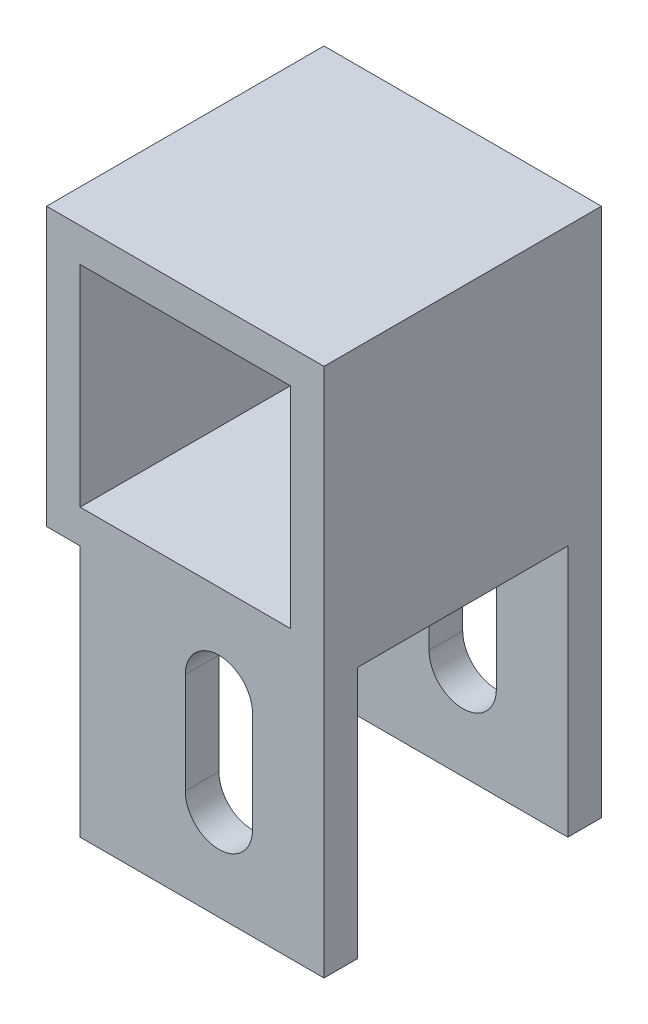
ISO-10303-21;
HEADER;
FILE_DESCRIPTION(('STEP AP214'),'2;1');
FILE_NAME('part.step','',(''),(''),'','','');
FILE_SCHEMA(('AUTOMOTIVE_DESIGN { 1 0 10303 214 1 1 1 1 }'));
ENDSEC;
DATA;
#1=APPLICATION_CONTEXT('core data for automotive mechanical design processes');
#2=APPLICATION_PROTOCOL_DEFINITION('international standard','automotive_design',2000,#1);
#3=PRODUCT_CONTEXT('',#1,'mechanical');
#4=PRODUCT('Part','Part','',(#3));
#5=PRODUCT_RELATED_PRODUCT_CATEGORY('part','',(#4));
#6=PRODUCT_DEFINITION_FORMATION('','',#4);
#7=PRODUCT_DEFINITION_CONTEXT('part definition',#1,'design');
#8=PRODUCT_DEFINITION('design','',#6,#7);
#9=PRODUCT_DEFINITION_SHAPE('','',#8);
#10=(LENGTH_UNIT() NAMED_UNIT(*) SI_UNIT(.MILLI.,.METRE.));
#11=(NAMED_UNIT(*) PLANE_ANGLE_UNIT() SI_UNIT($,.RADIAN.));
#12=(NAMED_UNIT(*) SI_UNIT($,.STERADIAN.) SOLID_ANGLE_UNIT());
#13=UNCERTAINTY_MEASURE_WITH_UNIT(LENGTH_MEASURE(1.E-05),#10,'distance_accuracy_value','');
#14=(GEOMETRIC_REPRESENTATION_CONTEXT(3) GLOBAL_UNCERTAINTY_ASSIGNED_CONTEXT((#13)) GLOBAL_UNIT_ASSIGNED_CONTEXT((#10,
#11,#12)) REPRESENTATION_CONTEXT('',''));
#15=CARTESIAN_POINT('',(0.,0.,0.));
#16=DIRECTION('',(0.,0.,1.));
#17=DIRECTION('',(1.,0.,0.));
#18=AXIS2_PLACEMENT_3D('',#15,#16,#17);
#19=CARTESIAN_POINT('',(0.,0.,33.));
#20=DIRECTION('',(0.,0.,1.));
#21=DIRECTION('',(1.,0.,0.));
#22=AXIS2_PLACEMENT_3D('',#19,#20,#21);
#23=PLANE('',#22);
#24=CARTESIAN_POINT('',(4.,-23.5,33.));
#25=DIRECTION('',(0.,0.,-1.));
#26=DIRECTION('',(-1.,0.,0.));
#27=AXIS2_PLACEMENT_3D('',#24,#25,#26);
#28=CIRCLE('',#27,4.);
#29=CARTESIAN_POINT('',(0.,-23.5,33.));
#30=VERTEX_POINT('',#29);
#31=CARTESIAN_POINT('',(8.,-23.5,33.));
#32=VERTEX_POINT('',#31);
#33=EDGE_CURVE('E188',#30,#32,#28,.T.);
#34=ORIENTED_EDGE('',*,*,#33,.T.);
#35=DIRECTION('',(0.,-1.,0.));
#36=VECTOR('',#35,1.);
#37=CARTESIAN_POINT('',(8.,-23.5,33.));
#38=LINE('',#37,#36);
#39=CARTESIAN_POINT('',(8.,-35.5,33.));
#40=VERTEX_POINT('',#39);
#41=EDGE_CURVE('E198',#32,#40,#38,.T.);
#42=ORIENTED_EDGE('',*,*,#41,.T.);
#43=CARTESIAN_POINT('',(4.,-35.5,33.));
#44=DIRECTION('',(0.,0.,-1.));
#45=DIRECTION('',(-1.,0.,0.));
#46=AXIS2_PLACEMENT_3D('',#43,#44,#45);
#47=CIRCLE('',#46,4.);
#48=CARTESIAN_POINT('',(0.,-35.5,33.));
#49=VERTEX_POINT('',#48);
#50=EDGE_CURVE('E48',#40,#49,#47,.T.);
#51=ORIENTED_EDGE('',*,*,#50,.T.);
#52=DIRECTION('',(0.,1.,0.));
#53=VECTOR('',#52,1.);
#54=CARTESIAN_POINT('',(0.,-23.5,33.));
#55=LINE('',#54,#53);
#56=EDGE_CURVE('E205',#49,#30,#55,.T.);
#57=ORIENTED_EDGE('',*,*,#56,.T.);
#58=EDGE_LOOP('',(#34,#42,#51,#57));
#59=FACE_BOUND('',#58,.T.);
#60=DIRECTION('',(0.,-1.,0.));
#61=VECTOR('',#60,1.);
#62=CARTESIAN_POINT('',(-12.5,-16.5,33.));
#63=LINE('',#62,#61);
#64=CARTESIAN_POINT('',(-12.5,-16.5,33.));
#65=VERTEX_POINT('',#64);
#66=CARTESIAN_POINT('',(-12.5,-46.5,33.));
#67=VERTEX_POINT('',#66);
#68=EDGE_CURVE('E257',#65,#67,#63,.T.);
#69=ORIENTED_EDGE('',*,*,#68,.T.);
#70=DIRECTION('',(-1.,0.,0.));
#71=VECTOR('',#70,1.);
#72=CARTESIAN_POINT('',(-16.5,-46.5,33.));
#73=LINE('',#72,#71);
#74=CARTESIAN_POINT('',(16.5,-46.5,33.));
#75=VERTEX_POINT('',#74);
#76=EDGE_CURVE('E278',#75,#67,#73,.T.);
#77=ORIENTED_EDGE('',*,*,#76,.F.);
#78=DIRECTION('',(0.,1.,0.));
#79=VECTOR('',#78,1.);
#80=CARTESIAN_POINT('',(16.5,16.5,33.));
#81=LINE('',#80,#79);
#82=CARTESIAN_POINT('',(16.5,16.5,33.));
#83=VERTEX_POINT('',#82);
#84=EDGE_CURVE('E318',#75,#83,#81,.T.);
#85=ORIENTED_EDGE('',*,*,#84,.T.);
#86=DIRECTION('',(-1.,0.,0.));
#87=VECTOR('',#86,1.);
#88=CARTESIAN_POINT('',(-16.5,16.5,33.));
#89=LINE('',#88,#87);
#90=CARTESIAN_POINT('',(-16.5,16.5,33.));
#91=VERTEX_POINT('',#90);
#92=EDGE_CURVE('E320',#83,#91,#89,.T.);
#93=ORIENTED_EDGE('',*,*,#92,.T.);
#94=DIRECTION('',(0.,-1.,0.));
#95=VECTOR('',#94,1.);
#96=CARTESIAN_POINT('',(-16.5,16.5,33.));
#97=LINE('',#96,#95);
#98=CARTESIAN_POINT('',(-16.5,-16.5,33.));
#99=VERTEX_POINT('',#98);
#100=EDGE_CURVE('E323',#91,#99,#97,.T.);
#101=ORIENTED_EDGE('',*,*,#100,.T.);
#102=DIRECTION('',(-1.,0.,0.));
#103=VECTOR('',#102,1.);
#104=CARTESIAN_POINT('',(-16.5,-16.5,33.));
#105=LINE('',#104,#103);
#106=EDGE_CURVE('E252',#65,#99,#105,.T.);
#107=ORIENTED_EDGE('',*,*,#106,.F.);
#108=EDGE_LOOP('',(#69,#77,#85,#93,#101,#107));
#109=FACE_BOUND('',#108,.T.);
#110=DIRECTION('',(1.,0.,0.));
#111=VECTOR('',#110,1.);
#112=CARTESIAN_POINT('',(-12.5,-12.5,33.));
#113=LINE('',#112,#111);
#114=CARTESIAN_POINT('',(-12.5,-12.5,33.));
#115=VERTEX_POINT('',#114);
#116=CARTESIAN_POINT('',(12.5,-12.5,33.));
#117=VERTEX_POINT('',#116);
#118=EDGE_CURVE('E296',#115,#117,#113,.T.);
#119=ORIENTED_EDGE('',*,*,#118,.F.);
#120=DIRECTION('',(0.,-1.,0.));
#121=VECTOR('',#120,1.);
#122=CARTESIAN_POINT('',(-12.5,12.5,33.));
#123=LINE('',#122,#121);
#124=CARTESIAN_POINT('',(-12.5,12.5,33.));
#125=VERTEX_POINT('',#124);
#126=EDGE_CURVE('E293',#125,#115,#123,.T.);
#127=ORIENTED_EDGE('',*,*,#126,.F.);
#128=DIRECTION('',(-1.,0.,0.));
#129=VECTOR('',#128,1.);
#130=CARTESIAN_POINT('',(-12.5,12.5,33.));
#131=LINE('',#130,#129);
#132=CARTESIAN_POINT('',(12.5,12.5,33.));
#133=VERTEX_POINT('',#132);
#134=EDGE_CURVE('E290',#133,#125,#131,.T.);
#135=ORIENTED_EDGE('',*,*,#134,.F.);
#136=DIRECTION('',(0.,1.,0.));
#137=VECTOR('',#136,1.);
#138=CARTESIAN_POINT('',(12.5,12.5,33.));
#139=LINE('',#138,#137);
#140=EDGE_CURVE('E288',#117,#133,#139,.T.);
#141=ORIENTED_EDGE('',*,*,#140,.F.);
#142=EDGE_LOOP('',(#119,#127,#135,#141));
#143=FACE_BOUND('',#142,.T.);
#144=ADVANCED_FACE('F33',(#59,#109,#143),#23,.T.);
#145=CARTESIAN_POINT('',(0.,0.,0.));
#146=DIRECTION('',(0.,0.,1.));
#147=DIRECTION('',(1.,0.,0.));
#148=AXIS2_PLACEMENT_3D('',#145,#146,#147);
#149=PLANE('',#148);
#150=DIRECTION('',(0.,-1.,0.));
#151=VECTOR('',#150,1.);
#152=CARTESIAN_POINT('',(8.,-23.5,0.));
#153=LINE('',#152,#151);
#154=CARTESIAN_POINT('',(8.,-23.5,0.));
#155=VERTEX_POINT('',#154);
#156=CARTESIAN_POINT('',(8.,-35.5,0.));
#157=VERTEX_POINT('',#156);
#158=EDGE_CURVE('E215',#155,#157,#153,.T.);
#159=ORIENTED_EDGE('',*,*,#158,.F.);
#160=CARTESIAN_POINT('',(4.,-23.5,0.));
#161=DIRECTION('',(0.,0.,-1.));
#162=DIRECTION('',(-1.,0.,0.));
#163=AXIS2_PLACEMENT_3D('',#160,#161,#162);
#164=CIRCLE('',#163,4.);
#165=CARTESIAN_POINT('',(0.,-23.5,0.));
#166=VERTEX_POINT('',#165);
#167=EDGE_CURVE('E56',#166,#155,#164,.T.);
#168=ORIENTED_EDGE('',*,*,#167,.F.);
#169=DIRECTION('',(0.,1.,0.));
#170=VECTOR('',#169,1.);
#171=CARTESIAN_POINT('',(0.,-23.5,0.));
#172=LINE('',#171,#170);
#173=CARTESIAN_POINT('',(0.,-35.5,0.));
#174=VERTEX_POINT('',#173);
#175=EDGE_CURVE('E206',#174,#166,#172,.T.);
#176=ORIENTED_EDGE('',*,*,#175,.F.);
#177=CARTESIAN_POINT('',(4.,-35.5,0.));
#178=DIRECTION('',(0.,0.,-1.));
#179=DIRECTION('',(-1.,0.,0.));
#180=AXIS2_PLACEMENT_3D('',#177,#178,#179);
#181=CIRCLE('',#180,4.);
#182=EDGE_CURVE('E209',#157,#174,#181,.T.);
#183=ORIENTED_EDGE('',*,*,#182,.F.);
#184=EDGE_LOOP('',(#159,#168,#176,#183));
#185=FACE_BOUND('',#184,.T.);
#186=DIRECTION('',(0.,-1.,0.));
#187=VECTOR('',#186,1.);
#188=CARTESIAN_POINT('',(-12.5,12.5,0.));
#189=LINE('',#188,#187);
#190=CARTESIAN_POINT('',(-12.5,12.5,0.));
#191=VERTEX_POINT('',#190);
#192=CARTESIAN_POINT('',(-12.5,-12.5,0.));
#193=VERTEX_POINT('',#192);
#194=EDGE_CURVE('E304',#191,#193,#189,.T.);
#195=ORIENTED_EDGE('',*,*,#194,.T.);
#196=DIRECTION('',(1.,0.,0.));
#197=VECTOR('',#196,1.);
#198=CARTESIAN_POINT('',(-12.5,-12.5,0.));
#199=LINE('',#198,#197);
#200=CARTESIAN_POINT('',(12.5,-12.5,0.));
#201=VERTEX_POINT('',#200);
#202=EDGE_CURVE('E291',#193,#201,#199,.T.);
#203=ORIENTED_EDGE('',*,*,#202,.T.);
#204=DIRECTION('',(0.,1.,0.));
#205=VECTOR('',#204,1.);
#206=CARTESIAN_POINT('',(12.5,12.5,0.));
#207=LINE('',#206,#205);
#208=CARTESIAN_POINT('',(12.5,12.5,0.));
#209=VERTEX_POINT('',#208);
#210=EDGE_CURVE('E287',#201,#209,#207,.T.);
#211=ORIENTED_EDGE('',*,*,#210,.T.);
#212=DIRECTION('',(-1.,0.,0.));
#213=VECTOR('',#212,1.);
#214=CARTESIAN_POINT('',(-12.5,12.5,0.));
#215=LINE('',#214,#213);
#216=EDGE_CURVE('E301',#209,#191,#215,.T.);
#217=ORIENTED_EDGE('',*,*,#216,.T.);
#218=EDGE_LOOP('',(#195,#203,#211,#217));
#219=FACE_BOUND('',#218,.T.);
#220=DIRECTION('',(1.,0.,0.));
#221=VECTOR('',#220,1.);
#222=CARTESIAN_POINT('',(16.5,-46.5,0.));
#223=LINE('',#222,#221);
#224=CARTESIAN_POINT('',(-12.5,-46.5,0.));
#225=VERTEX_POINT('',#224);
#226=CARTESIAN_POINT('',(16.5,-46.5,0.));
#227=VERTEX_POINT('',#226);
#228=EDGE_CURVE('E267',#225,#227,#223,.T.);
#229=ORIENTED_EDGE('',*,*,#228,.F.);
#230=DIRECTION('',(0.,-1.,0.));
#231=VECTOR('',#230,1.);
#232=CARTESIAN_POINT('',(-12.5,-16.5,0.));
#233=LINE('',#232,#231);
#234=CARTESIAN_POINT('',(-12.5,-16.5,0.));
#235=VERTEX_POINT('',#234);
#236=EDGE_CURVE('E242',#235,#225,#233,.T.);
#237=ORIENTED_EDGE('',*,*,#236,.F.);
#238=DIRECTION('',(1.,0.,0.));
#239=VECTOR('',#238,1.);
#240=CARTESIAN_POINT('',(-16.5,-16.5,0.));
#241=LINE('',#240,#239);
#242=CARTESIAN_POINT('',(-16.5,-16.5,0.));
#243=VERTEX_POINT('',#242);
#244=EDGE_CURVE('E236',#243,#235,#241,.T.);
#245=ORIENTED_EDGE('',*,*,#244,.F.);
#246=DIRECTION('',(0.,-1.,0.));
#247=VECTOR('',#246,1.);
#248=CARTESIAN_POINT('',(-16.5,16.5,0.));
#249=LINE('',#248,#247);
#250=CARTESIAN_POINT('',(-16.5,16.5,0.));
#251=VERTEX_POINT('',#250);
#252=EDGE_CURVE('E321',#251,#243,#249,.T.);
#253=ORIENTED_EDGE('',*,*,#252,.F.);
#254=DIRECTION('',(-1.,0.,0.));
#255=VECTOR('',#254,1.);
#256=CARTESIAN_POINT('',(-16.5,16.5,0.));
#257=LINE('',#256,#255);
#258=CARTESIAN_POINT('',(16.5,16.5,0.));
#259=VERTEX_POINT('',#258);
#260=EDGE_CURVE('E328',#259,#251,#257,.T.);
#261=ORIENTED_EDGE('',*,*,#260,.F.);
#262=DIRECTION('',(0.,1.,0.));
#263=VECTOR('',#262,1.);
#264=CARTESIAN_POINT('',(16.5,16.5,0.));
#265=LINE('',#264,#263);
#266=EDGE_CURVE('E317',#227,#259,#265,.T.);
#267=ORIENTED_EDGE('',*,*,#266,.F.);
#268=EDGE_LOOP('',(#229,#237,#245,#253,#261,#267));
#269=FACE_BOUND('',#268,.T.);
#270=ADVANCED_FACE('F366',(#185,#219,#269),#149,.F.);
#271=CARTESIAN_POINT('',(16.5,16.5,33.));
#272=DIRECTION('',(-1.,0.,0.));
#273=DIRECTION('',(0.,-1.,0.));
#274=AXIS2_PLACEMENT_3D('',#271,#272,#273);
#275=PLANE('',#274);
#276=DIRECTION('',(0.,0.,-1.));
#277=VECTOR('',#276,1.);
#278=CARTESIAN_POINT('',(16.5,-16.5,33.));
#279=LINE('',#278,#277);
#280=CARTESIAN_POINT('',(16.5,-16.5,29.));
#281=VERTEX_POINT('',#280);
#282=CARTESIAN_POINT('',(16.5,-16.5,4.));
#283=VERTEX_POINT('',#282);
#284=EDGE_CURVE('E326',#281,#283,#279,.T.);
#285=ORIENTED_EDGE('',*,*,#284,.T.);
#286=DIRECTION('',(0.,-1.,0.));
#287=VECTOR('',#286,1.);
#288=CARTESIAN_POINT('',(16.5,-12.5,4.));
#289=LINE('',#288,#287);
#290=CARTESIAN_POINT('',(16.5,-46.5,4.));
#291=VERTEX_POINT('',#290);
#292=EDGE_CURVE('E269',#283,#291,#289,.T.);
#293=ORIENTED_EDGE('',*,*,#292,.T.);
#294=DIRECTION('',(0.,0.,1.));
#295=VECTOR('',#294,1.);
#296=CARTESIAN_POINT('',(16.5,-46.5,0.));
#297=LINE('',#296,#295);
#298=EDGE_CURVE('E260',#227,#291,#297,.T.);
#299=ORIENTED_EDGE('',*,*,#298,.F.);
#300=ORIENTED_EDGE('',*,*,#266,.T.);
#301=DIRECTION('',(0.,0.,-1.));
#302=VECTOR('',#301,1.);
#303=CARTESIAN_POINT('',(16.5,16.5,33.));
#304=LINE('',#303,#302);
#305=EDGE_CURVE('E339',#83,#259,#304,.T.);
#306=ORIENTED_EDGE('',*,*,#305,.F.);
#307=ORIENTED_EDGE('',*,*,#84,.F.);
#308=DIRECTION('',(0.,0.,1.));
#309=VECTOR('',#308,1.);
#310=CARTESIAN_POINT('',(16.5,-46.5,33.));
#311=LINE('',#310,#309);
#312=CARTESIAN_POINT('',(16.5,-46.5,29.));
#313=VERTEX_POINT('',#312);
#314=EDGE_CURVE('E275',#313,#75,#311,.T.);
#315=ORIENTED_EDGE('',*,*,#314,.F.);
#316=DIRECTION('',(0.,-1.,0.));
#317=VECTOR('',#316,1.);
#318=CARTESIAN_POINT('',(16.5,-12.5,29.));
#319=LINE('',#318,#317);
#320=EDGE_CURVE('E281',#281,#313,#319,.T.);
#321=ORIENTED_EDGE('',*,*,#320,.F.);
#322=EDGE_LOOP('',(#285,#293,#299,#300,#306,#307,#315,#321));
#323=FACE_BOUND('',#322,.T.);
#324=ADVANCED_FACE('F35',(#323),#275,.F.);
#325=CARTESIAN_POINT('',(-16.5,16.5,33.));
#326=DIRECTION('',(0.,-1.,0.));
#327=DIRECTION('',(0.,0.,-1.));
#328=AXIS2_PLACEMENT_3D('',#325,#326,#327);
#329=PLANE('',#328);
#330=ORIENTED_EDGE('',*,*,#260,.T.);
#331=DIRECTION('',(0.,0.,-1.));
#332=VECTOR('',#331,1.);
#333=CARTESIAN_POINT('',(-16.5,16.5,33.));
#334=LINE('',#333,#332);
#335=EDGE_CURVE('E336',#91,#251,#334,.T.);
#336=ORIENTED_EDGE('',*,*,#335,.F.);
#337=ORIENTED_EDGE('',*,*,#92,.F.);
#338=ORIENTED_EDGE('',*,*,#305,.T.);
#339=EDGE_LOOP('',(#330,#336,#337,#338));
#340=FACE_BOUND('',#339,.T.);
#341=ADVANCED_FACE('F396',(#340),#329,.F.);
#342=CARTESIAN_POINT('',(-16.5,16.5,33.));
#343=DIRECTION('',(1.,0.,0.));
#344=DIRECTION('',(0.,1.,0.));
#345=AXIS2_PLACEMENT_3D('',#342,#343,#344);
#346=PLANE('',#345);
#347=ORIENTED_EDGE('',*,*,#252,.T.);
#348=DIRECTION('',(0.,0.,-1.));
#349=VECTOR('',#348,1.);
#350=CARTESIAN_POINT('',(-16.5,-16.5,33.));
#351=LINE('',#350,#349);
#352=EDGE_CURVE('E334',#99,#243,#351,.T.);
#353=ORIENTED_EDGE('',*,*,#352,.F.);
#354=ORIENTED_EDGE('',*,*,#100,.F.);
#355=ORIENTED_EDGE('',*,*,#335,.T.);
#356=EDGE_LOOP('',(#347,#353,#354,#355));
#357=FACE_BOUND('',#356,.T.);
#358=ADVANCED_FACE('F391',(#357),#346,.F.);
#359=CARTESIAN_POINT('',(-16.5,-16.5,33.));
#360=DIRECTION('',(0.,1.,0.));
#361=DIRECTION('',(0.,0.,1.));
#362=AXIS2_PLACEMENT_3D('',#359,#360,#361);
#363=PLANE('',#362);
#364=ORIENTED_EDGE('',*,*,#352,.T.);
#365=ORIENTED_EDGE('',*,*,#244,.T.);
#366=DIRECTION('',(0.,0.,1.));
#367=VECTOR('',#366,1.);
#368=CARTESIAN_POINT('',(-12.5,-16.5,0.));
#369=LINE('',#368,#367);
#370=CARTESIAN_POINT('',(-12.5,-16.5,4.));
#371=VERTEX_POINT('',#370);
#372=EDGE_CURVE('E239',#235,#371,#369,.T.);
#373=ORIENTED_EDGE('',*,*,#372,.T.);
#374=DIRECTION('',(1.,0.,0.));
#375=VECTOR('',#374,1.);
#376=CARTESIAN_POINT('',(-16.5,-16.5,4.));
#377=LINE('',#376,#375);
#378=EDGE_CURVE('E271',#371,#283,#377,.T.);
#379=ORIENTED_EDGE('',*,*,#378,.T.);
#380=ORIENTED_EDGE('',*,*,#284,.F.);
#381=DIRECTION('',(-1.,0.,0.));
#382=VECTOR('',#381,1.);
#383=CARTESIAN_POINT('',(-16.5,-16.5,29.));
#384=LINE('',#383,#382);
#385=CARTESIAN_POINT('',(-12.5,-16.5,29.));
#386=VERTEX_POINT('',#385);
#387=EDGE_CURVE('E284',#281,#386,#384,.T.);
#388=ORIENTED_EDGE('',*,*,#387,.T.);
#389=DIRECTION('',(0.,0.,1.));
#390=VECTOR('',#389,1.);
#391=CARTESIAN_POINT('',(-12.5,-16.5,29.));
#392=LINE('',#391,#390);
#393=EDGE_CURVE('E249',#386,#65,#392,.T.);
#394=ORIENTED_EDGE('',*,*,#393,.T.);
#395=ORIENTED_EDGE('',*,*,#106,.T.);
#396=EDGE_LOOP('',(#364,#365,#373,#379,#380,#388,#394,#395));
#397=FACE_BOUND('',#396,.T.);
#398=ADVANCED_FACE('F388',(#397),#363,.F.);
#399=CARTESIAN_POINT('',(12.5,12.5,33.));
#400=DIRECTION('',(-1.,0.,0.));
#401=DIRECTION('',(0.,-1.,0.));
#402=AXIS2_PLACEMENT_3D('',#399,#400,#401);
#403=PLANE('',#402);
#404=ORIENTED_EDGE('',*,*,#210,.F.);
#405=DIRECTION('',(0.,0.,-1.));
#406=VECTOR('',#405,1.);
#407=CARTESIAN_POINT('',(12.5,-12.5,33.));
#408=LINE('',#407,#406);
#409=EDGE_CURVE('E298',#117,#201,#408,.T.);
#410=ORIENTED_EDGE('',*,*,#409,.F.);
#411=ORIENTED_EDGE('',*,*,#140,.T.);
#412=DIRECTION('',(0.,0.,-1.));
#413=VECTOR('',#412,1.);
#414=CARTESIAN_POINT('',(12.5,12.5,33.));
#415=LINE('',#414,#413);
#416=EDGE_CURVE('E314',#133,#209,#415,.T.);
#417=ORIENTED_EDGE('',*,*,#416,.T.);
#418=EDGE_LOOP('',(#404,#410,#411,#417));
#419=FACE_BOUND('',#418,.T.);
#420=ADVANCED_FACE('F426',(#419),#403,.T.);
#421=CARTESIAN_POINT('',(-12.5,12.5,33.));
#422=DIRECTION('',(0.,-1.,0.));
#423=DIRECTION('',(0.,0.,-1.));
#424=AXIS2_PLACEMENT_3D('',#421,#422,#423);
#425=PLANE('',#424);
#426=ORIENTED_EDGE('',*,*,#216,.F.);
#427=ORIENTED_EDGE('',*,*,#416,.F.);
#428=ORIENTED_EDGE('',*,*,#134,.T.);
#429=DIRECTION('',(0.,0.,-1.));
#430=VECTOR('',#429,1.);
#431=CARTESIAN_POINT('',(-12.5,12.5,33.));
#432=LINE('',#431,#430);
#433=EDGE_CURVE('E312',#125,#191,#432,.T.);
#434=ORIENTED_EDGE('',*,*,#433,.T.);
#435=EDGE_LOOP('',(#426,#427,#428,#434));
#436=FACE_BOUND('',#435,.T.);
#437=ADVANCED_FACE('F588',(#436),#425,.T.);
#438=CARTESIAN_POINT('',(-12.5,12.5,33.));
#439=DIRECTION('',(1.,0.,0.));
#440=DIRECTION('',(0.,1.,0.));
#441=AXIS2_PLACEMENT_3D('',#438,#439,#440);
#442=PLANE('',#441);
#443=ORIENTED_EDGE('',*,*,#194,.F.);
#444=ORIENTED_EDGE('',*,*,#433,.F.);
#445=ORIENTED_EDGE('',*,*,#126,.T.);
#446=DIRECTION('',(0.,0.,-1.));
#447=VECTOR('',#446,1.);
#448=CARTESIAN_POINT('',(-12.5,-12.5,33.));
#449=LINE('',#448,#447);
#450=EDGE_CURVE('E310',#115,#193,#449,.T.);
#451=ORIENTED_EDGE('',*,*,#450,.T.);
#452=EDGE_LOOP('',(#443,#444,#445,#451));
#453=FACE_BOUND('',#452,.T.);
#454=ADVANCED_FACE('F579',(#453),#442,.T.);
#455=CARTESIAN_POINT('',(-12.5,-12.5,33.));
#456=DIRECTION('',(0.,1.,0.));
#457=DIRECTION('',(0.,0.,1.));
#458=AXIS2_PLACEMENT_3D('',#455,#456,#457);
#459=PLANE('',#458);
#460=ORIENTED_EDGE('',*,*,#409,.T.);
#461=ORIENTED_EDGE('',*,*,#202,.F.);
#462=ORIENTED_EDGE('',*,*,#450,.F.);
#463=ORIENTED_EDGE('',*,*,#118,.T.);
#464=EDGE_LOOP('',(#460,#461,#462,#463));
#465=FACE_BOUND('',#464,.T.);
#466=ADVANCED_FACE('F458',(#465),#459,.T.);
#467=CARTESIAN_POINT('',(-16.5,-12.5,29.));
#468=DIRECTION('',(0.,0.,-1.));
#469=DIRECTION('',(-1.,0.,0.));
#470=AXIS2_PLACEMENT_3D('',#467,#468,#469);
#471=PLANE('',#470);
#472=CARTESIAN_POINT('',(4.,-23.5,29.));
#473=DIRECTION('',(0.,0.,-1.));
#474=DIRECTION('',(-1.,0.,0.));
#475=AXIS2_PLACEMENT_3D('',#472,#473,#474);
#476=CIRCLE('',#475,4.);
#477=CARTESIAN_POINT('',(0.,-23.5,29.));
#478=VERTEX_POINT('',#477);
#479=CARTESIAN_POINT('',(8.,-23.5,29.));
#480=VERTEX_POINT('',#479);
#481=EDGE_CURVE('E191',#478,#480,#476,.T.);
#482=ORIENTED_EDGE('',*,*,#481,.F.);
#483=DIRECTION('',(0.,1.,0.));
#484=VECTOR('',#483,1.);
#485=CARTESIAN_POINT('',(0.,-12.5,29.));
#486=LINE('',#485,#484);
#487=CARTESIAN_POINT('',(0.,-35.5,29.));
#488=VERTEX_POINT('',#487);
#489=EDGE_CURVE('E232',#488,#478,#486,.T.);
#490=ORIENTED_EDGE('',*,*,#489,.F.);
#491=CARTESIAN_POINT('',(4.,-35.5,29.));
#492=DIRECTION('',(0.,0.,-1.));
#493=DIRECTION('',(-1.,0.,0.));
#494=AXIS2_PLACEMENT_3D('',#491,#492,#493);
#495=CIRCLE('',#494,4.);
#496=CARTESIAN_POINT('',(8.,-35.5,29.));
#497=VERTEX_POINT('',#496);
#498=EDGE_CURVE('E230',#497,#488,#495,.T.);
#499=ORIENTED_EDGE('',*,*,#498,.F.);
#500=DIRECTION('',(0.,-1.,0.));
#501=VECTOR('',#500,1.);
#502=CARTESIAN_POINT('',(8.,-12.5,29.));
#503=LINE('',#502,#501);
#504=EDGE_CURVE('E222',#480,#497,#503,.T.);
#505=ORIENTED_EDGE('',*,*,#504,.F.);
#506=EDGE_LOOP('',(#482,#490,#499,#505));
#507=FACE_BOUND('',#506,.T.);
#508=DIRECTION('',(0.,-1.,0.));
#509=VECTOR('',#508,1.);
#510=CARTESIAN_POINT('',(-12.5,-16.5,29.));
#511=LINE('',#510,#509);
#512=CARTESIAN_POINT('',(-12.5,-46.5,29.));
#513=VERTEX_POINT('',#512);
#514=EDGE_CURVE('E255',#386,#513,#511,.T.);
#515=ORIENTED_EDGE('',*,*,#514,.F.);
#516=ORIENTED_EDGE('',*,*,#387,.F.);
#517=ORIENTED_EDGE('',*,*,#320,.T.);
#518=DIRECTION('',(1.,0.,0.));
#519=VECTOR('',#518,1.);
#520=CARTESIAN_POINT('',(-16.5,-46.5,29.));
#521=LINE('',#520,#519);
#522=EDGE_CURVE('E273',#513,#313,#521,.T.);
#523=ORIENTED_EDGE('',*,*,#522,.F.);
#524=EDGE_LOOP('',(#515,#516,#517,#523));
#525=FACE_BOUND('',#524,.T.);
#526=ADVANCED_FACE('F404',(#507,#525),#471,.T.);
#527=CARTESIAN_POINT('',(0.,-46.5,0.));
#528=DIRECTION('',(0.,-1.,0.));
#529=DIRECTION('',(0.,0.,-1.));
#530=AXIS2_PLACEMENT_3D('',#527,#528,#529);
#531=PLANE('',#530);
#532=DIRECTION('',(0.,0.,1.));
#533=VECTOR('',#532,1.);
#534=CARTESIAN_POINT('',(-12.5,-46.5,29.));
#535=LINE('',#534,#533);
#536=EDGE_CURVE('E247',#513,#67,#535,.T.);
#537=ORIENTED_EDGE('',*,*,#536,.F.);
#538=ORIENTED_EDGE('',*,*,#522,.T.);
#539=ORIENTED_EDGE('',*,*,#314,.T.);
#540=ORIENTED_EDGE('',*,*,#76,.T.);
#541=EDGE_LOOP('',(#537,#538,#539,#540));
#542=FACE_BOUND('',#541,.T.);
#543=ADVANCED_FACE('F411',(#542),#531,.T.);
#544=CARTESIAN_POINT('',(16.5,-12.5,4.));
#545=DIRECTION('',(0.,0.,1.));
#546=DIRECTION('',(1.,0.,0.));
#547=AXIS2_PLACEMENT_3D('',#544,#545,#546);
#548=PLANE('',#547);
#549=CARTESIAN_POINT('',(4.,-23.5,4.));
#550=DIRECTION('',(0.,0.,1.));
#551=DIRECTION('',(1.,0.,0.));
#552=AXIS2_PLACEMENT_3D('',#549,#550,#551);
#553=CIRCLE('',#552,4.);
#554=CARTESIAN_POINT('',(8.,-23.5,4.));
#555=VERTEX_POINT('',#554);
#556=CARTESIAN_POINT('',(0.,-23.5,4.));
#557=VERTEX_POINT('',#556);
#558=EDGE_CURVE('E11',#555,#557,#553,.T.);
#559=ORIENTED_EDGE('',*,*,#558,.F.);
#560=DIRECTION('',(0.,1.,0.));
#561=VECTOR('',#560,1.);
#562=CARTESIAN_POINT('',(8.,-12.5,4.));
#563=LINE('',#562,#561);
#564=CARTESIAN_POINT('',(8.,-35.5,4.));
#565=VERTEX_POINT('',#564);
#566=EDGE_CURVE('E342',#565,#555,#563,.T.);
#567=ORIENTED_EDGE('',*,*,#566,.F.);
#568=CARTESIAN_POINT('',(4.,-35.5,4.));
#569=DIRECTION('',(0.,0.,1.));
#570=DIRECTION('',(1.,0.,0.));
#571=AXIS2_PLACEMENT_3D('',#568,#569,#570);
#572=CIRCLE('',#571,4.);
#573=CARTESIAN_POINT('',(0.,-35.5,4.));
#574=VERTEX_POINT('',#573);
#575=EDGE_CURVE('E344',#574,#565,#572,.T.);
#576=ORIENTED_EDGE('',*,*,#575,.F.);
#577=DIRECTION('',(0.,-1.,0.));
#578=VECTOR('',#577,1.);
#579=CARTESIAN_POINT('',(0.,-12.5,4.));
#580=LINE('',#579,#578);
#581=EDGE_CURVE('E41',#557,#574,#580,.T.);
#582=ORIENTED_EDGE('',*,*,#581,.F.);
#583=EDGE_LOOP('',(#559,#567,#576,#582));
#584=FACE_BOUND('',#583,.T.);
#585=DIRECTION('',(0.,-1.,0.));
#586=VECTOR('',#585,1.);
#587=CARTESIAN_POINT('',(-12.5,-16.5,4.));
#588=LINE('',#587,#586);
#589=CARTESIAN_POINT('',(-12.5,-46.5,4.));
#590=VERTEX_POINT('',#589);
#591=EDGE_CURVE('E244',#371,#590,#588,.T.);
#592=ORIENTED_EDGE('',*,*,#591,.T.);
#593=DIRECTION('',(-1.,0.,0.));
#594=VECTOR('',#593,1.);
#595=CARTESIAN_POINT('',(16.5,-46.5,4.));
#596=LINE('',#595,#594);
#597=EDGE_CURVE('E264',#291,#590,#596,.T.);
#598=ORIENTED_EDGE('',*,*,#597,.F.);
#599=ORIENTED_EDGE('',*,*,#292,.F.);
#600=ORIENTED_EDGE('',*,*,#378,.F.);
#601=EDGE_LOOP('',(#592,#598,#599,#600));
#602=FACE_BOUND('',#601,.T.);
#603=ADVANCED_FACE('F359',(#584,#602),#548,.T.);
#604=CARTESIAN_POINT('',(0.,-46.5,0.));
#605=DIRECTION('',(0.,-1.,0.));
#606=DIRECTION('',(0.,0.,-1.));
#607=AXIS2_PLACEMENT_3D('',#604,#605,#606);
#608=PLANE('',#607);
#609=DIRECTION('',(0.,0.,1.));
#610=VECTOR('',#609,1.);
#611=CARTESIAN_POINT('',(-12.5,-46.5,0.));
#612=LINE('',#611,#610);
#613=EDGE_CURVE('E235',#225,#590,#612,.T.);
#614=ORIENTED_EDGE('',*,*,#613,.F.);
#615=ORIENTED_EDGE('',*,*,#228,.T.);
#616=ORIENTED_EDGE('',*,*,#298,.T.);
#617=ORIENTED_EDGE('',*,*,#597,.T.);
#618=EDGE_LOOP('',(#614,#615,#616,#617));
#619=FACE_BOUND('',#618,.T.);
#620=ADVANCED_FACE('F380',(#619),#608,.T.);
#621=CARTESIAN_POINT('',(-12.5,-16.5,29.));
#622=DIRECTION('',(1.,0.,0.));
#623=DIRECTION('',(0.,0.,-1.));
#624=AXIS2_PLACEMENT_3D('',#621,#622,#623);
#625=PLANE('',#624);
#626=ORIENTED_EDGE('',*,*,#536,.T.);
#627=ORIENTED_EDGE('',*,*,#68,.F.);
#628=ORIENTED_EDGE('',*,*,#393,.F.);
#629=ORIENTED_EDGE('',*,*,#514,.T.);
#630=EDGE_LOOP('',(#626,#627,#628,#629));
#631=FACE_BOUND('',#630,.T.);
#632=ADVANCED_FACE('F412',(#631),#625,.F.);
#633=CARTESIAN_POINT('',(-12.5,-16.5,0.));
#634=DIRECTION('',(1.,0.,0.));
#635=DIRECTION('',(0.,0.,-1.));
#636=AXIS2_PLACEMENT_3D('',#633,#634,#635);
#637=PLANE('',#636);
#638=ORIENTED_EDGE('',*,*,#613,.T.);
#639=ORIENTED_EDGE('',*,*,#591,.F.);
#640=ORIENTED_EDGE('',*,*,#372,.F.);
#641=ORIENTED_EDGE('',*,*,#236,.T.);
#642=EDGE_LOOP('',(#638,#639,#640,#641));
#643=FACE_BOUND('',#642,.T.);
#644=ADVANCED_FACE('F383',(#643),#637,.F.);
#645=CARTESIAN_POINT('',(8.,-23.5,33.));
#646=DIRECTION('',(1.,0.,0.));
#647=DIRECTION('',(0.,0.,-1.));
#648=AXIS2_PLACEMENT_3D('',#645,#646,#647);
#649=PLANE('',#648);
#650=ORIENTED_EDGE('',*,*,#566,.T.);
#651=DIRECTION('',(0.,0.,-1.));
#652=VECTOR('',#651,1.);
#653=CARTESIAN_POINT('',(8.,-23.5,33.));
#654=LINE('',#653,#652);
#655=EDGE_CURVE('E195',#555,#155,#654,.T.);
#656=ORIENTED_EDGE('',*,*,#655,.T.);
#657=ORIENTED_EDGE('',*,*,#158,.T.);
#658=DIRECTION('',(0.,0.,-1.));
#659=VECTOR('',#658,1.);
#660=CARTESIAN_POINT('',(8.,-35.5,33.));
#661=LINE('',#660,#659);
#662=EDGE_CURVE('E194',#565,#157,#661,.T.);
#663=ORIENTED_EDGE('',*,*,#662,.F.);
#664=EDGE_LOOP('',(#650,#656,#657,#663));
#665=FACE_BOUND('',#664,.T.);
#666=ADVANCED_FACE('F362',(#665),#649,.F.);
#667=CARTESIAN_POINT('',(4.,-35.5,33.));
#668=DIRECTION('',(0.,0.,-1.));
#669=DIRECTION('',(-1.,0.,0.));
#670=AXIS2_PLACEMENT_3D('',#667,#668,#669);
#671=CYLINDRICAL_SURFACE('',#670,4.);
#672=ORIENTED_EDGE('',*,*,#575,.T.);
#673=ORIENTED_EDGE('',*,*,#662,.T.);
#674=ORIENTED_EDGE('',*,*,#182,.T.);
#675=DIRECTION('',(0.,0.,-1.));
#676=VECTOR('',#675,1.);
#677=CARTESIAN_POINT('',(0.,-35.5,33.));
#678=LINE('',#677,#676);
#679=EDGE_CURVE('E227',#574,#174,#678,.T.);
#680=ORIENTED_EDGE('',*,*,#679,.F.);
#681=EDGE_LOOP('',(#672,#673,#674,#680));
#682=FACE_BOUND('',#681,.T.);
#683=ADVANCED_FACE('F355',(#682),#671,.F.);
#684=CARTESIAN_POINT('',(0.,-23.5,33.));
#685=DIRECTION('',(-1.,0.,0.));
#686=DIRECTION('',(0.,-1.,0.));
#687=AXIS2_PLACEMENT_3D('',#684,#685,#686);
#688=PLANE('',#687);
#689=ORIENTED_EDGE('',*,*,#581,.T.);
#690=ORIENTED_EDGE('',*,*,#679,.T.);
#691=ORIENTED_EDGE('',*,*,#175,.T.);
#692=DIRECTION('',(0.,0.,-1.));
#693=VECTOR('',#692,1.);
#694=CARTESIAN_POINT('',(0.,-23.5,33.));
#695=LINE('',#694,#693);
#696=EDGE_CURVE('E223',#557,#166,#695,.T.);
#697=ORIENTED_EDGE('',*,*,#696,.F.);
#698=EDGE_LOOP('',(#689,#690,#691,#697));
#699=FACE_BOUND('',#698,.T.);
#700=ADVANCED_FACE('F350',(#699),#688,.F.);
#701=CARTESIAN_POINT('',(4.,-23.5,33.));
#702=DIRECTION('',(0.,0.,-1.));
#703=DIRECTION('',(-1.,0.,0.));
#704=AXIS2_PLACEMENT_3D('',#701,#702,#703);
#705=CYLINDRICAL_SURFACE('',#704,4.);
#706=ORIENTED_EDGE('',*,*,#558,.T.);
#707=ORIENTED_EDGE('',*,*,#696,.T.);
#708=ORIENTED_EDGE('',*,*,#167,.T.);
#709=ORIENTED_EDGE('',*,*,#655,.F.);
#710=EDGE_LOOP('',(#706,#707,#708,#709));
#711=FACE_BOUND('',#710,.T.);
#712=ADVANCED_FACE('F364',(#711),#705,.F.);
#713=ORIENTED_EDGE('',*,*,#481,.T.);
#714=EDGE_CURVE('E183',#32,#480,#654,.T.);
#715=ORIENTED_EDGE('',*,*,#714,.F.);
#716=ORIENTED_EDGE('',*,*,#33,.F.);
#717=EDGE_CURVE('E220',#30,#478,#695,.T.);
#718=ORIENTED_EDGE('',*,*,#717,.T.);
#719=EDGE_LOOP('',(#713,#715,#716,#718));
#720=FACE_BOUND('',#719,.T.);
#721=ADVANCED_FACE('F185',(#720),#705,.F.);
#722=ORIENTED_EDGE('',*,*,#489,.T.);
#723=ORIENTED_EDGE('',*,*,#717,.F.);
#724=ORIENTED_EDGE('',*,*,#56,.F.);
#725=EDGE_CURVE('E224',#49,#488,#678,.T.);
#726=ORIENTED_EDGE('',*,*,#725,.T.);
#727=EDGE_LOOP('',(#722,#723,#724,#726));
#728=FACE_BOUND('',#727,.T.);
#729=ADVANCED_FACE('F500',(#728),#688,.F.);
#730=ORIENTED_EDGE('',*,*,#498,.T.);
#731=ORIENTED_EDGE('',*,*,#725,.F.);
#732=ORIENTED_EDGE('',*,*,#50,.F.);
#733=EDGE_CURVE('E200',#40,#497,#661,.T.);
#734=ORIENTED_EDGE('',*,*,#733,.T.);
#735=EDGE_LOOP('',(#730,#731,#732,#734));
#736=FACE_BOUND('',#735,.T.);
#737=ADVANCED_FACE('F491',(#736),#671,.F.);
#738=ORIENTED_EDGE('',*,*,#504,.T.);
#739=ORIENTED_EDGE('',*,*,#733,.F.);
#740=ORIENTED_EDGE('',*,*,#41,.F.);
#741=ORIENTED_EDGE('',*,*,#714,.T.);
#742=EDGE_LOOP('',(#738,#739,#740,#741));
#743=FACE_BOUND('',#742,.T.);
#744=ADVANCED_FACE('F199',(#743),#649,.F.);
#745=CLOSED_SHELL('',(#144,#270,#324,#341,#358,#398,#420,#437,#454,#466,#526,#543,#603,#620,
#632,#644,#666,#683,#700,#712,#721,#729,#737,#744));
#746=MANIFOLD_SOLID_BREP('B2',#745);
#747=ADVANCED_BREP_SHAPE_REPRESENTATION('',(#18,#746),#14);
#748=SHAPE_DEFINITION_REPRESENTATION(#9,#747);
ENDSEC;
END-ISO-10303-21;
